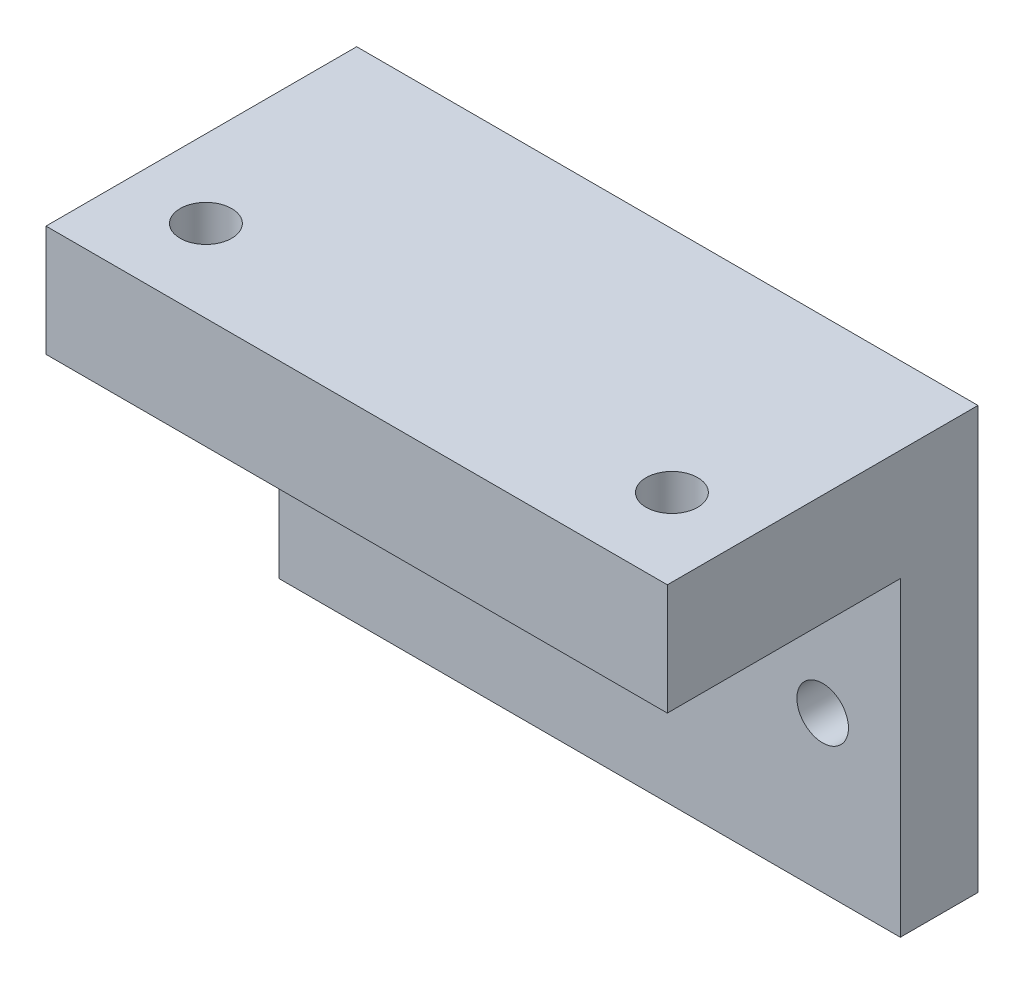
ISO-10303-21;
HEADER;
FILE_DESCRIPTION(('STEP AP214'),'2;1');
FILE_NAME('part.step','',(''),(''),'','','');
FILE_SCHEMA(('AUTOMOTIVE_DESIGN { 1 0 10303 214 1 1 1 1 }'));
ENDSEC;
DATA;
#1=APPLICATION_CONTEXT('core data for automotive mechanical design processes');
#2=APPLICATION_PROTOCOL_DEFINITION('international standard','automotive_design',2000,#1);
#3=PRODUCT_CONTEXT('',#1,'mechanical');
#4=PRODUCT('Part','Part','',(#3));
#5=PRODUCT_RELATED_PRODUCT_CATEGORY('part','',(#4));
#6=PRODUCT_DEFINITION_FORMATION('','',#4);
#7=PRODUCT_DEFINITION_CONTEXT('part definition',#1,'design');
#8=PRODUCT_DEFINITION('design','',#6,#7);
#9=PRODUCT_DEFINITION_SHAPE('','',#8);
#10=(LENGTH_UNIT() NAMED_UNIT(*) SI_UNIT(.MILLI.,.METRE.));
#11=(NAMED_UNIT(*) PLANE_ANGLE_UNIT() SI_UNIT($,.RADIAN.));
#12=(NAMED_UNIT(*) SI_UNIT($,.STERADIAN.) SOLID_ANGLE_UNIT());
#13=UNCERTAINTY_MEASURE_WITH_UNIT(LENGTH_MEASURE(1.E-05),#10,'distance_accuracy_value','');
#14=(GEOMETRIC_REPRESENTATION_CONTEXT(3) GLOBAL_UNCERTAINTY_ASSIGNED_CONTEXT((#13)) GLOBAL_UNIT_ASSIGNED_CONTEXT((#10,
#11,#12)) REPRESENTATION_CONTEXT('',''));
#15=CARTESIAN_POINT('',(0.,0.,0.));
#16=DIRECTION('',(0.,0.,1.));
#17=DIRECTION('',(1.,0.,0.));
#18=AXIS2_PLACEMENT_3D('',#15,#16,#17);
#19=CARTESIAN_POINT('',(40.,-20.,10.));
#20=DIRECTION('',(-1.,0.,0.));
#21=DIRECTION('',(0.,0.,1.));
#22=AXIS2_PLACEMENT_3D('',#19,#20,#21);
#23=PLANE('',#22);
#24=DIRECTION('',(0.,1.,0.));
#25=VECTOR('',#24,1.);
#26=CARTESIAN_POINT('',(40.,-20.,0.));
#27=LINE('',#26,#25);
#28=CARTESIAN_POINT('',(40.,-20.,0.));
#29=VERTEX_POINT('',#28);
#30=CARTESIAN_POINT('',(40.,34.3063956868619,0.));
#31=VERTEX_POINT('',#30);
#32=EDGE_CURVE('E103',#29,#31,#27,.T.);
#33=ORIENTED_EDGE('',*,*,#32,.T.);
#34=DIRECTION('',(0.,0.,-1.));
#35=VECTOR('',#34,1.);
#36=CARTESIAN_POINT('',(40.,34.3063956868619,40.));
#37=LINE('',#36,#35);
#38=CARTESIAN_POINT('',(40.,34.3063956868619,40.));
#39=VERTEX_POINT('',#38);
#40=EDGE_CURVE('E139',#39,#31,#37,.T.);
#41=ORIENTED_EDGE('',*,*,#40,.F.);
#42=DIRECTION('',(0.,1.,0.));
#43=VECTOR('',#42,1.);
#44=CARTESIAN_POINT('',(40.,20.,40.));
#45=LINE('',#44,#43);
#46=CARTESIAN_POINT('',(40.,20.,40.));
#47=VERTEX_POINT('',#46);
#48=EDGE_CURVE('E126',#47,#39,#45,.T.);
#49=ORIENTED_EDGE('',*,*,#48,.F.);
#50=DIRECTION('',(0.,0.,-1.));
#51=VECTOR('',#50,1.);
#52=CARTESIAN_POINT('',(40.,20.,40.));
#53=LINE('',#52,#51);
#54=CARTESIAN_POINT('',(40.,20.,10.));
#55=VERTEX_POINT('',#54);
#56=EDGE_CURVE('E91',#47,#55,#53,.T.);
#57=ORIENTED_EDGE('',*,*,#56,.T.);
#58=DIRECTION('',(0.,1.,0.));
#59=VECTOR('',#58,1.);
#60=CARTESIAN_POINT('',(40.,-20.,10.));
#61=LINE('',#60,#59);
#62=CARTESIAN_POINT('',(40.,-20.,10.));
#63=VERTEX_POINT('',#62);
#64=EDGE_CURVE('E96',#63,#55,#61,.T.);
#65=ORIENTED_EDGE('',*,*,#64,.F.);
#66=DIRECTION('',(0.,0.,-1.));
#67=VECTOR('',#66,1.);
#68=CARTESIAN_POINT('',(40.,-20.,10.));
#69=LINE('',#68,#67);
#70=EDGE_CURVE('E44',#63,#29,#69,.T.);
#71=ORIENTED_EDGE('',*,*,#70,.T.);
#72=EDGE_LOOP('',(#33,#41,#49,#57,#65,#71));
#73=FACE_BOUND('',#72,.T.);
#74=ADVANCED_FACE('F35',(#73),#23,.F.);
#75=CARTESIAN_POINT('',(-40.,-20.,10.));
#76=DIRECTION('',(1.,0.,0.));
#77=DIRECTION('',(0.,0.,-1.));
#78=AXIS2_PLACEMENT_3D('',#75,#76,#77);
#79=PLANE('',#78);
#80=DIRECTION('',(0.,-1.,0.));
#81=VECTOR('',#80,1.);
#82=CARTESIAN_POINT('',(-40.,-20.,0.));
#83=LINE('',#82,#81);
#84=CARTESIAN_POINT('',(-40.,34.3063956868619,0.));
#85=VERTEX_POINT('',#84);
#86=CARTESIAN_POINT('',(-40.,-20.,0.));
#87=VERTEX_POINT('',#86);
#88=EDGE_CURVE('E65',#85,#87,#83,.T.);
#89=ORIENTED_EDGE('',*,*,#88,.T.);
#90=DIRECTION('',(0.,0.,-1.));
#91=VECTOR('',#90,1.);
#92=CARTESIAN_POINT('',(-40.,-20.,10.));
#93=LINE('',#92,#91);
#94=CARTESIAN_POINT('',(-40.,-20.,10.));
#95=VERTEX_POINT('',#94);
#96=EDGE_CURVE('E11',#95,#87,#93,.T.);
#97=ORIENTED_EDGE('',*,*,#96,.F.);
#98=DIRECTION('',(0.,-1.,0.));
#99=VECTOR('',#98,1.);
#100=CARTESIAN_POINT('',(-40.,-20.,10.));
#101=LINE('',#100,#99);
#102=CARTESIAN_POINT('',(-40.,20.,10.));
#103=VERTEX_POINT('',#102);
#104=EDGE_CURVE('E94',#103,#95,#101,.T.);
#105=ORIENTED_EDGE('',*,*,#104,.F.);
#106=DIRECTION('',(0.,0.,-1.));
#107=VECTOR('',#106,1.);
#108=CARTESIAN_POINT('',(-40.,20.,40.));
#109=LINE('',#108,#107);
#110=CARTESIAN_POINT('',(-40.,20.,40.));
#111=VERTEX_POINT('',#110);
#112=EDGE_CURVE('E83',#111,#103,#109,.T.);
#113=ORIENTED_EDGE('',*,*,#112,.F.);
#114=DIRECTION('',(0.,1.,0.));
#115=VECTOR('',#114,1.);
#116=CARTESIAN_POINT('',(-40.,20.,40.));
#117=LINE('',#116,#115);
#118=CARTESIAN_POINT('',(-40.,34.3063956868619,40.));
#119=VERTEX_POINT('',#118);
#120=EDGE_CURVE('E132',#111,#119,#117,.T.);
#121=ORIENTED_EDGE('',*,*,#120,.T.);
#122=DIRECTION('',(0.,0.,-1.));
#123=VECTOR('',#122,1.);
#124=CARTESIAN_POINT('',(-40.,34.3063956868619,40.));
#125=LINE('',#124,#123);
#126=EDGE_CURVE('E90',#119,#85,#125,.T.);
#127=ORIENTED_EDGE('',*,*,#126,.T.);
#128=EDGE_LOOP('',(#89,#97,#105,#113,#121,#127));
#129=FACE_BOUND('',#128,.T.);
#130=ADVANCED_FACE('F98',(#129),#79,.F.);
#131=CARTESIAN_POINT('',(-40.,-20.,10.));
#132=DIRECTION('',(0.,1.,0.));
#133=DIRECTION('',(0.,0.,1.));
#134=AXIS2_PLACEMENT_3D('',#131,#132,#133);
#135=PLANE('',#134);
#136=DIRECTION('',(1.,0.,0.));
#137=VECTOR('',#136,1.);
#138=CARTESIAN_POINT('',(-40.,-20.,0.));
#139=LINE('',#138,#137);
#140=EDGE_CURVE('E108',#87,#29,#139,.T.);
#141=ORIENTED_EDGE('',*,*,#140,.T.);
#142=ORIENTED_EDGE('',*,*,#70,.F.);
#143=DIRECTION('',(1.,0.,0.));
#144=VECTOR('',#143,1.);
#145=CARTESIAN_POINT('',(-40.,-20.,10.));
#146=LINE('',#145,#144);
#147=EDGE_CURVE('E53',#95,#63,#146,.T.);
#148=ORIENTED_EDGE('',*,*,#147,.F.);
#149=ORIENTED_EDGE('',*,*,#96,.T.);
#150=EDGE_LOOP('',(#141,#142,#148,#149));
#151=FACE_BOUND('',#150,.T.);
#152=ADVANCED_FACE('F158',(#151),#135,.F.);
#153=CARTESIAN_POINT('',(0.,0.,10.));
#154=DIRECTION('',(0.,0.,-1.));
#155=DIRECTION('',(-1.,0.,0.));
#156=AXIS2_PLACEMENT_3D('',#153,#154,#155);
#157=PLANE('',#156);
#158=CARTESIAN_POINT('',(30.,0.,10.));
#159=DIRECTION('',(0.,0.,1.));
#160=DIRECTION('',(1.,0.,0.));
#161=AXIS2_PLACEMENT_3D('',#158,#159,#160);
#162=CIRCLE('',#161,3.32000000000001);
#163=CARTESIAN_POINT('',(33.32,0.,10.));
#164=VERTEX_POINT('',#163);
#165=EDGE_CURVE('E145',#164,#164,#162,.T.);
#166=ORIENTED_EDGE('',*,*,#165,.F.);
#167=EDGE_LOOP('',(#166));
#168=FACE_BOUND('',#167,.T.);
#169=CARTESIAN_POINT('',(-30.,0.,10.));
#170=DIRECTION('',(0.,0.,1.));
#171=DIRECTION('',(1.,0.,0.));
#172=AXIS2_PLACEMENT_3D('',#169,#170,#171);
#173=CIRCLE('',#172,3.32);
#174=CARTESIAN_POINT('',(-26.68,0.,10.));
#175=VERTEX_POINT('',#174);
#176=EDGE_CURVE('E142',#175,#175,#173,.T.);
#177=ORIENTED_EDGE('',*,*,#176,.F.);
#178=EDGE_LOOP('',(#177));
#179=FACE_BOUND('',#178,.T.);
#180=ORIENTED_EDGE('',*,*,#64,.T.);
#181=DIRECTION('',(-1.,0.,0.));
#182=VECTOR('',#181,1.);
#183=CARTESIAN_POINT('',(-40.,20.,10.));
#184=LINE('',#183,#182);
#185=EDGE_CURVE('E74',#55,#103,#184,.T.);
#186=ORIENTED_EDGE('',*,*,#185,.T.);
#187=ORIENTED_EDGE('',*,*,#104,.T.);
#188=ORIENTED_EDGE('',*,*,#147,.T.);
#189=EDGE_LOOP('',(#180,#186,#187,#188));
#190=FACE_BOUND('',#189,.T.);
#191=ADVANCED_FACE('F93',(#168,#179,#190),#157,.F.);
#192=CARTESIAN_POINT('',(0.,0.,0.));
#193=DIRECTION('',(0.,0.,-1.));
#194=DIRECTION('',(-1.,0.,0.));
#195=AXIS2_PLACEMENT_3D('',#192,#193,#194);
#196=PLANE('',#195);
#197=CARTESIAN_POINT('',(30.,0.,0.));
#198=DIRECTION('',(0.,0.,1.));
#199=DIRECTION('',(1.,0.,0.));
#200=AXIS2_PLACEMENT_3D('',#197,#198,#199);
#201=CIRCLE('',#200,3.32000000000001);
#202=CARTESIAN_POINT('',(33.32,0.,0.));
#203=VERTEX_POINT('',#202);
#204=EDGE_CURVE('E106',#203,#203,#201,.T.);
#205=ORIENTED_EDGE('',*,*,#204,.T.);
#206=EDGE_LOOP('',(#205));
#207=FACE_BOUND('',#206,.T.);
#208=CARTESIAN_POINT('',(-30.,0.,0.));
#209=DIRECTION('',(0.,0.,1.));
#210=DIRECTION('',(1.,0.,0.));
#211=AXIS2_PLACEMENT_3D('',#208,#209,#210);
#212=CIRCLE('',#211,3.32);
#213=CARTESIAN_POINT('',(-26.68,0.,0.));
#214=VERTEX_POINT('',#213);
#215=EDGE_CURVE('E148',#214,#214,#212,.T.);
#216=ORIENTED_EDGE('',*,*,#215,.T.);
#217=EDGE_LOOP('',(#216));
#218=FACE_BOUND('',#217,.T.);
#219=ORIENTED_EDGE('',*,*,#32,.F.);
#220=ORIENTED_EDGE('',*,*,#140,.F.);
#221=ORIENTED_EDGE('',*,*,#88,.F.);
#222=DIRECTION('',(-1.,0.,0.));
#223=VECTOR('',#222,1.);
#224=CARTESIAN_POINT('',(40.,34.3063956868619,0.));
#225=LINE('',#224,#223);
#226=EDGE_CURVE('E117',#31,#85,#225,.T.);
#227=ORIENTED_EDGE('',*,*,#226,.F.);
#228=EDGE_LOOP('',(#219,#220,#221,#227));
#229=FACE_BOUND('',#228,.T.);
#230=ADVANCED_FACE('F157',(#207,#218,#229),#196,.T.);
#231=CARTESIAN_POINT('',(-30.,0.,0.));
#232=DIRECTION('',(0.,0.,1.));
#233=DIRECTION('',(1.,0.,0.));
#234=AXIS2_PLACEMENT_3D('',#231,#232,#233);
#235=CYLINDRICAL_SURFACE('',#234,3.32);
#236=ORIENTED_EDGE('',*,*,#215,.F.);
#237=EDGE_LOOP('',(#236));
#238=FACE_BOUND('',#237,.T.);
#239=ORIENTED_EDGE('',*,*,#176,.T.);
#240=EDGE_LOOP('',(#239));
#241=FACE_BOUND('',#240,.T.);
#242=ADVANCED_FACE('F154',(#238,#241),#235,.F.);
#243=CARTESIAN_POINT('',(30.,0.,0.));
#244=DIRECTION('',(0.,0.,1.));
#245=DIRECTION('',(1.,0.,0.));
#246=AXIS2_PLACEMENT_3D('',#243,#244,#245);
#247=CYLINDRICAL_SURFACE('',#246,3.32000000000001);
#248=ORIENTED_EDGE('',*,*,#204,.F.);
#249=EDGE_LOOP('',(#248));
#250=FACE_BOUND('',#249,.T.);
#251=ORIENTED_EDGE('',*,*,#165,.T.);
#252=EDGE_LOOP('',(#251));
#253=FACE_BOUND('',#252,.T.);
#254=ADVANCED_FACE('F209',(#250,#253),#247,.F.);
#255=CARTESIAN_POINT('',(40.,20.,40.));
#256=DIRECTION('',(0.,-1.,0.));
#257=DIRECTION('',(0.,0.,-1.));
#258=AXIS2_PLACEMENT_3D('',#255,#256,#257);
#259=PLANE('',#258);
#260=CARTESIAN_POINT('',(30.,20.,29.4090645103893));
#261=DIRECTION('',(0.,-1.,0.));
#262=DIRECTION('',(0.,0.,-1.));
#263=AXIS2_PLACEMENT_3D('',#260,#261,#262);
#264=CIRCLE('',#263,3.32);
#265=CARTESIAN_POINT('',(30.,20.,26.0890645103893));
#266=VERTEX_POINT('',#265);
#267=EDGE_CURVE('E113',#266,#266,#264,.T.);
#268=ORIENTED_EDGE('',*,*,#267,.F.);
#269=EDGE_LOOP('',(#268));
#270=FACE_BOUND('',#269,.T.);
#271=CARTESIAN_POINT('',(-30.,20.,29.4090645103893));
#272=DIRECTION('',(0.,-1.,0.));
#273=DIRECTION('',(0.,0.,-1.));
#274=AXIS2_PLACEMENT_3D('',#271,#272,#273);
#275=CIRCLE('',#274,3.32);
#276=CARTESIAN_POINT('',(-30.,20.,26.0890645103893));
#277=VERTEX_POINT('',#276);
#278=EDGE_CURVE('E119',#277,#277,#275,.T.);
#279=ORIENTED_EDGE('',*,*,#278,.F.);
#280=EDGE_LOOP('',(#279));
#281=FACE_BOUND('',#280,.T.);
#282=ORIENTED_EDGE('',*,*,#185,.F.);
#283=ORIENTED_EDGE('',*,*,#56,.F.);
#284=DIRECTION('',(-1.,0.,0.));
#285=VECTOR('',#284,1.);
#286=CARTESIAN_POINT('',(40.,20.,40.));
#287=LINE('',#286,#285);
#288=EDGE_CURVE('E86',#47,#111,#287,.T.);
#289=ORIENTED_EDGE('',*,*,#288,.T.);
#290=ORIENTED_EDGE('',*,*,#112,.T.);
#291=EDGE_LOOP('',(#282,#283,#289,#290));
#292=FACE_BOUND('',#291,.T.);
#293=ADVANCED_FACE('F84',(#270,#281,#292),#259,.T.);
#294=CARTESIAN_POINT('',(40.,34.3063956868619,40.));
#295=DIRECTION('',(0.,-1.,0.));
#296=DIRECTION('',(0.,0.,-1.));
#297=AXIS2_PLACEMENT_3D('',#294,#295,#296);
#298=PLANE('',#297);
#299=CARTESIAN_POINT('',(30.,34.3063956868619,29.4090645103893));
#300=DIRECTION('',(0.,-1.,0.));
#301=DIRECTION('',(0.,0.,-1.));
#302=AXIS2_PLACEMENT_3D('',#299,#300,#301);
#303=CIRCLE('',#302,3.32);
#304=CARTESIAN_POINT('',(30.,34.3063956868619,26.0890645103893));
#305=VERTEX_POINT('',#304);
#306=EDGE_CURVE('E38',#305,#305,#303,.T.);
#307=ORIENTED_EDGE('',*,*,#306,.T.);
#308=EDGE_LOOP('',(#307));
#309=FACE_BOUND('',#308,.T.);
#310=CARTESIAN_POINT('',(-30.,34.3063956868619,29.4090645103893));
#311=DIRECTION('',(0.,-1.,0.));
#312=DIRECTION('',(0.,0.,-1.));
#313=AXIS2_PLACEMENT_3D('',#310,#311,#312);
#314=CIRCLE('',#313,3.32);
#315=CARTESIAN_POINT('',(-30.,34.3063956868619,26.0890645103893));
#316=VERTEX_POINT('',#315);
#317=EDGE_CURVE('E111',#316,#316,#314,.T.);
#318=ORIENTED_EDGE('',*,*,#317,.T.);
#319=EDGE_LOOP('',(#318));
#320=FACE_BOUND('',#319,.T.);
#321=ORIENTED_EDGE('',*,*,#226,.T.);
#322=ORIENTED_EDGE('',*,*,#126,.F.);
#323=DIRECTION('',(-1.,0.,0.));
#324=VECTOR('',#323,1.);
#325=CARTESIAN_POINT('',(40.,34.3063956868619,40.));
#326=LINE('',#325,#324);
#327=EDGE_CURVE('E129',#39,#119,#326,.T.);
#328=ORIENTED_EDGE('',*,*,#327,.F.);
#329=ORIENTED_EDGE('',*,*,#40,.T.);
#330=EDGE_LOOP('',(#321,#322,#328,#329));
#331=FACE_BOUND('',#330,.T.);
#332=ADVANCED_FACE('F187',(#309,#320,#331),#298,.F.);
#333=CARTESIAN_POINT('',(0.,0.,40.));
#334=DIRECTION('',(0.,0.,1.));
#335=DIRECTION('',(1.,0.,0.));
#336=AXIS2_PLACEMENT_3D('',#333,#334,#335);
#337=PLANE('',#336);
#338=ORIENTED_EDGE('',*,*,#48,.T.);
#339=ORIENTED_EDGE('',*,*,#327,.T.);
#340=ORIENTED_EDGE('',*,*,#120,.F.);
#341=ORIENTED_EDGE('',*,*,#288,.F.);
#342=EDGE_LOOP('',(#338,#339,#340,#341));
#343=FACE_BOUND('',#342,.T.);
#344=ADVANCED_FACE('F191',(#343),#337,.T.);
#345=CARTESIAN_POINT('',(-30.,60.,29.4090645103893));
#346=DIRECTION('',(0.,-1.,0.));
#347=DIRECTION('',(0.,0.,-1.));
#348=AXIS2_PLACEMENT_3D('',#345,#346,#347);
#349=CYLINDRICAL_SURFACE('',#348,3.32);
#350=ORIENTED_EDGE('',*,*,#278,.T.);
#351=EDGE_LOOP('',(#350));
#352=FACE_BOUND('',#351,.T.);
#353=ORIENTED_EDGE('',*,*,#317,.F.);
#354=EDGE_LOOP('',(#353));
#355=FACE_BOUND('',#354,.T.);
#356=ADVANCED_FACE('F195',(#352,#355),#349,.F.);
#357=CARTESIAN_POINT('',(30.,60.,29.4090645103893));
#358=DIRECTION('',(0.,-1.,0.));
#359=DIRECTION('',(0.,0.,-1.));
#360=AXIS2_PLACEMENT_3D('',#357,#358,#359);
#361=CYLINDRICAL_SURFACE('',#360,3.32);
#362=ORIENTED_EDGE('',*,*,#267,.T.);
#363=EDGE_LOOP('',(#362));
#364=FACE_BOUND('',#363,.T.);
#365=ORIENTED_EDGE('',*,*,#306,.F.);
#366=EDGE_LOOP('',(#365));
#367=FACE_BOUND('',#366,.T.);
#368=ADVANCED_FACE('F201',(#364,#367),#361,.F.);
#369=CLOSED_SHELL('',(#74,#130,#152,#191,#230,#242,#254,#293,#332,#344,#356,#368));
#370=MANIFOLD_SOLID_BREP('B2',#369);
#371=ADVANCED_BREP_SHAPE_REPRESENTATION('',(#18,#370),#14);
#372=SHAPE_DEFINITION_REPRESENTATION(#9,#371);
ENDSEC;
END-ISO-10303-21;
